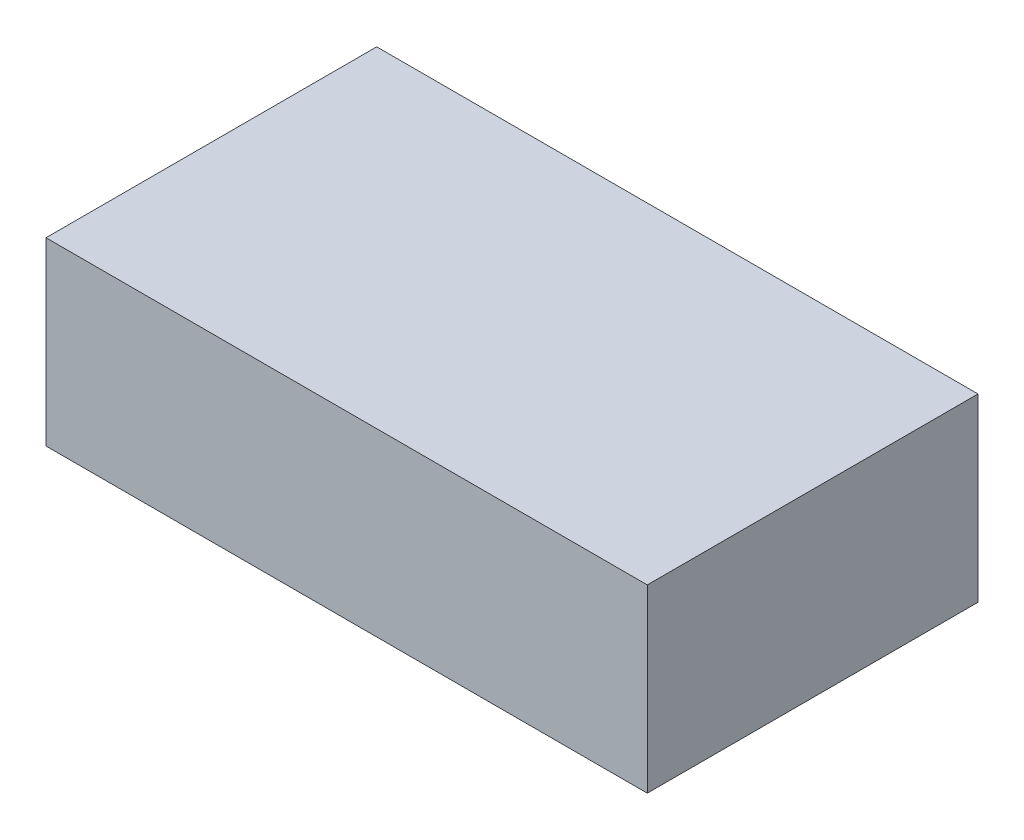
ISO-10303-21;
HEADER;
FILE_DESCRIPTION(('STEP AP214'),'2;1');
FILE_NAME('part.step','',(''),(''),'','','');
FILE_SCHEMA(('AUTOMOTIVE_DESIGN { 1 0 10303 214 1 1 1 1 }'));
ENDSEC;
DATA;
#1=APPLICATION_CONTEXT('core data for automotive mechanical design processes');
#2=APPLICATION_PROTOCOL_DEFINITION('international standard','automotive_design',2000,#1);
#3=PRODUCT_CONTEXT('',#1,'mechanical');
#4=PRODUCT('Part','Part','',(#3));
#5=PRODUCT_RELATED_PRODUCT_CATEGORY('part','',(#4));
#6=PRODUCT_DEFINITION_FORMATION('','',#4);
#7=PRODUCT_DEFINITION_CONTEXT('part definition',#1,'design');
#8=PRODUCT_DEFINITION('design','',#6,#7);
#9=PRODUCT_DEFINITION_SHAPE('','',#8);
#10=(LENGTH_UNIT() NAMED_UNIT(*) SI_UNIT(.MILLI.,.METRE.));
#11=(NAMED_UNIT(*) PLANE_ANGLE_UNIT() SI_UNIT($,.RADIAN.));
#12=(NAMED_UNIT(*) SI_UNIT($,.STERADIAN.) SOLID_ANGLE_UNIT());
#13=UNCERTAINTY_MEASURE_WITH_UNIT(LENGTH_MEASURE(1.E-05),#10,'distance_accuracy_value','');
#14=(GEOMETRIC_REPRESENTATION_CONTEXT(3) GLOBAL_UNCERTAINTY_ASSIGNED_CONTEXT((#13)) GLOBAL_UNIT_ASSIGNED_CONTEXT((#10,
#11,#12)) REPRESENTATION_CONTEXT('',''));
#15=CARTESIAN_POINT('',(0.,0.,0.));
#16=DIRECTION('',(0.,0.,1.));
#17=DIRECTION('',(1.,0.,0.));
#18=AXIS2_PLACEMENT_3D('',#15,#16,#17);
#19=CARTESIAN_POINT('',(31.75,19.05,17.4625));
#20=DIRECTION('',(-1.,0.,0.));
#21=DIRECTION('',(0.,0.,1.));
#22=AXIS2_PLACEMENT_3D('',#19,#20,#21);
#23=PLANE('',#22);
#24=DIRECTION('',(0.,0.,-1.));
#25=VECTOR('',#24,1.);
#26=CARTESIAN_POINT('',(31.75,0.,17.4625));
#27=LINE('',#26,#25);
#28=CARTESIAN_POINT('',(31.75,0.,17.4625));
#29=VERTEX_POINT('',#28);
#30=CARTESIAN_POINT('',(31.75,0.,-17.4625));
#31=VERTEX_POINT('',#30);
#32=EDGE_CURVE('E96',#29,#31,#27,.T.);
#33=ORIENTED_EDGE('',*,*,#32,.T.);
#34=DIRECTION('',(0.,-1.,0.));
#35=VECTOR('',#34,1.);
#36=CARTESIAN_POINT('',(31.75,19.05,-17.4625));
#37=LINE('',#36,#35);
#38=CARTESIAN_POINT('',(31.75,19.05,-17.4625));
#39=VERTEX_POINT('',#38);
#40=EDGE_CURVE('E11',#39,#31,#37,.T.);
#41=ORIENTED_EDGE('',*,*,#40,.F.);
#42=DIRECTION('',(0.,0.,-1.));
#43=VECTOR('',#42,1.);
#44=CARTESIAN_POINT('',(31.75,19.05,17.4625));
#45=LINE('',#44,#43);
#46=CARTESIAN_POINT('',(31.75,19.05,17.4625));
#47=VERTEX_POINT('',#46);
#48=EDGE_CURVE('E84',#47,#39,#45,.T.);
#49=ORIENTED_EDGE('',*,*,#48,.F.);
#50=DIRECTION('',(0.,-1.,0.));
#51=VECTOR('',#50,1.);
#52=CARTESIAN_POINT('',(31.75,19.05,17.4625));
#53=LINE('',#52,#51);
#54=EDGE_CURVE('E92',#47,#29,#53,.T.);
#55=ORIENTED_EDGE('',*,*,#54,.T.);
#56=EDGE_LOOP('',(#33,#41,#49,#55));
#57=FACE_BOUND('',#56,.T.);
#58=ADVANCED_FACE('F33',(#57),#23,.F.);
#59=CARTESIAN_POINT('',(-31.75,19.05,-17.4625));
#60=DIRECTION('',(0.,0.,1.));
#61=DIRECTION('',(1.,0.,0.));
#62=AXIS2_PLACEMENT_3D('',#59,#60,#61);
#63=PLANE('',#62);
#64=DIRECTION('',(-1.,0.,0.));
#65=VECTOR('',#64,1.);
#66=CARTESIAN_POINT('',(-31.75,0.,-17.4625));
#67=LINE('',#66,#65);
#68=CARTESIAN_POINT('',(-31.75,0.,-17.4625));
#69=VERTEX_POINT('',#68);
#70=EDGE_CURVE('E88',#31,#69,#67,.T.);
#71=ORIENTED_EDGE('',*,*,#70,.T.);
#72=DIRECTION('',(0.,-1.,0.));
#73=VECTOR('',#72,1.);
#74=CARTESIAN_POINT('',(-31.75,19.05,-17.4625));
#75=LINE('',#74,#73);
#76=CARTESIAN_POINT('',(-31.75,19.05,-17.4625));
#77=VERTEX_POINT('',#76);
#78=EDGE_CURVE('E41',#77,#69,#75,.T.);
#79=ORIENTED_EDGE('',*,*,#78,.F.);
#80=DIRECTION('',(-1.,0.,0.));
#81=VECTOR('',#80,1.);
#82=CARTESIAN_POINT('',(-31.75,19.05,-17.4625));
#83=LINE('',#82,#81);
#84=EDGE_CURVE('E79',#39,#77,#83,.T.);
#85=ORIENTED_EDGE('',*,*,#84,.F.);
#86=ORIENTED_EDGE('',*,*,#40,.T.);
#87=EDGE_LOOP('',(#71,#79,#85,#86));
#88=FACE_BOUND('',#87,.T.);
#89=ADVANCED_FACE('F87',(#88),#63,.F.);
#90=CARTESIAN_POINT('',(-31.75,19.05,17.4625));
#91=DIRECTION('',(1.,0.,0.));
#92=DIRECTION('',(0.,0.,-1.));
#93=AXIS2_PLACEMENT_3D('',#90,#91,#92);
#94=PLANE('',#93);
#95=DIRECTION('',(0.,0.,1.));
#96=VECTOR('',#95,1.);
#97=CARTESIAN_POINT('',(-31.75,0.,17.4625));
#98=LINE('',#97,#96);
#99=CARTESIAN_POINT('',(-31.75,0.,17.4625));
#100=VERTEX_POINT('',#99);
#101=EDGE_CURVE('E66',#69,#100,#98,.T.);
#102=ORIENTED_EDGE('',*,*,#101,.T.);
#103=DIRECTION('',(0.,-1.,0.));
#104=VECTOR('',#103,1.);
#105=CARTESIAN_POINT('',(-31.75,19.05,17.4625));
#106=LINE('',#105,#104);
#107=CARTESIAN_POINT('',(-31.75,19.05,17.4625));
#108=VERTEX_POINT('',#107);
#109=EDGE_CURVE('E89',#108,#100,#106,.T.);
#110=ORIENTED_EDGE('',*,*,#109,.F.);
#111=DIRECTION('',(0.,0.,1.));
#112=VECTOR('',#111,1.);
#113=CARTESIAN_POINT('',(-31.75,19.05,17.4625));
#114=LINE('',#113,#112);
#115=EDGE_CURVE('E82',#77,#108,#114,.T.);
#116=ORIENTED_EDGE('',*,*,#115,.F.);
#117=ORIENTED_EDGE('',*,*,#78,.T.);
#118=EDGE_LOOP('',(#102,#110,#116,#117));
#119=FACE_BOUND('',#118,.T.);
#120=ADVANCED_FACE('F90',(#119),#94,.F.);
#121=CARTESIAN_POINT('',(-31.75,19.05,17.4625));
#122=DIRECTION('',(0.,0.,-1.));
#123=DIRECTION('',(-1.,0.,0.));
#124=AXIS2_PLACEMENT_3D('',#121,#122,#123);
#125=PLANE('',#124);
#126=DIRECTION('',(1.,0.,0.));
#127=VECTOR('',#126,1.);
#128=CARTESIAN_POINT('',(-31.75,0.,17.4625));
#129=LINE('',#128,#127);
#130=EDGE_CURVE('E72',#100,#29,#129,.T.);
#131=ORIENTED_EDGE('',*,*,#130,.T.);
#132=ORIENTED_EDGE('',*,*,#54,.F.);
#133=DIRECTION('',(1.,0.,0.));
#134=VECTOR('',#133,1.);
#135=CARTESIAN_POINT('',(-31.75,19.05,17.4625));
#136=LINE('',#135,#134);
#137=EDGE_CURVE('E49',#108,#47,#136,.T.);
#138=ORIENTED_EDGE('',*,*,#137,.F.);
#139=ORIENTED_EDGE('',*,*,#109,.T.);
#140=EDGE_LOOP('',(#131,#132,#138,#139));
#141=FACE_BOUND('',#140,.T.);
#142=ADVANCED_FACE('F103',(#141),#125,.F.);
#143=CARTESIAN_POINT('',(0.,19.05,0.));
#144=DIRECTION('',(0.,-1.,0.));
#145=DIRECTION('',(0.,0.,-1.));
#146=AXIS2_PLACEMENT_3D('',#143,#144,#145);
#147=PLANE('',#146);
#148=ORIENTED_EDGE('',*,*,#48,.T.);
#149=ORIENTED_EDGE('',*,*,#84,.T.);
#150=ORIENTED_EDGE('',*,*,#115,.T.);
#151=ORIENTED_EDGE('',*,*,#137,.T.);
#152=EDGE_LOOP('',(#148,#149,#150,#151));
#153=FACE_BOUND('',#152,.T.);
#154=ADVANCED_FACE('F80',(#153),#147,.F.);
#155=CARTESIAN_POINT('',(0.,0.,0.));
#156=DIRECTION('',(0.,-1.,0.));
#157=DIRECTION('',(0.,0.,-1.));
#158=AXIS2_PLACEMENT_3D('',#155,#156,#157);
#159=PLANE('',#158);
#160=ORIENTED_EDGE('',*,*,#32,.F.);
#161=ORIENTED_EDGE('',*,*,#130,.F.);
#162=ORIENTED_EDGE('',*,*,#101,.F.);
#163=ORIENTED_EDGE('',*,*,#70,.F.);
#164=EDGE_LOOP('',(#160,#161,#162,#163));
#165=FACE_BOUND('',#164,.T.);
#166=ADVANCED_FACE('F106',(#165),#159,.T.);
#167=CLOSED_SHELL('',(#58,#89,#120,#142,#154,#166));
#168=MANIFOLD_SOLID_BREP('B2',#167);
#169=ADVANCED_BREP_SHAPE_REPRESENTATION('',(#18,#168),#14);
#170=SHAPE_DEFINITION_REPRESENTATION(#9,#169);
ENDSEC;
END-ISO-10303-21;
